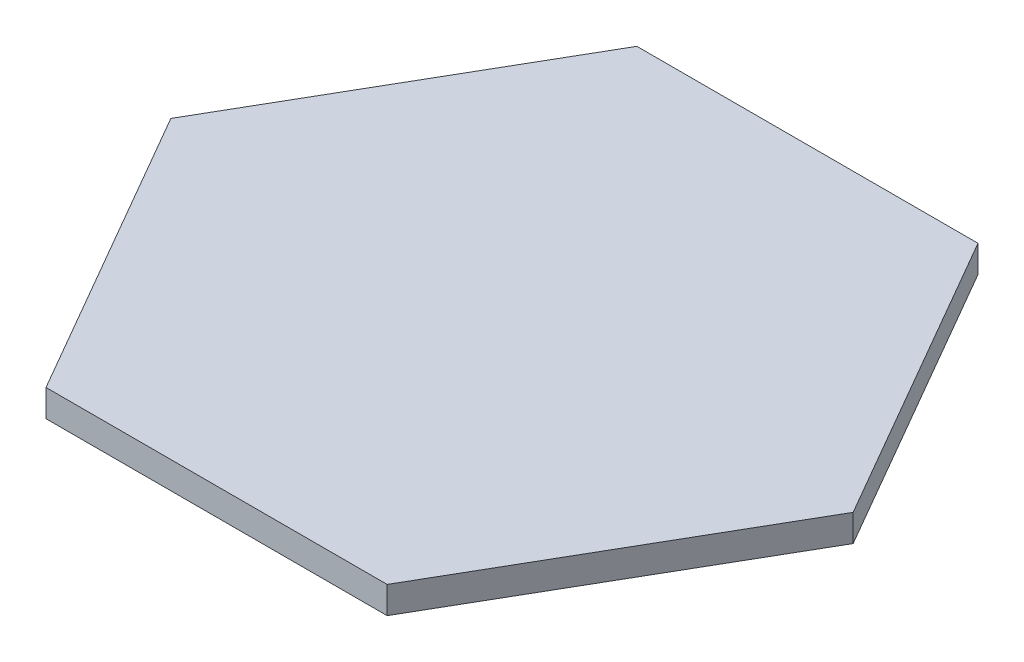
ISO-10303-21;
HEADER;
FILE_DESCRIPTION(('STEP AP214'),'2;1');
FILE_NAME('part.step','',(''),(''),'','','');
FILE_SCHEMA(('AUTOMOTIVE_DESIGN { 1 0 10303 214 1 1 1 1 }'));
ENDSEC;
DATA;
#1=APPLICATION_CONTEXT('core data for automotive mechanical design processes');
#2=APPLICATION_PROTOCOL_DEFINITION('international standard','automotive_design',2000,#1);
#3=PRODUCT_CONTEXT('',#1,'mechanical');
#4=PRODUCT('Part','Part','',(#3));
#5=PRODUCT_RELATED_PRODUCT_CATEGORY('part','',(#4));
#6=PRODUCT_DEFINITION_FORMATION('','',#4);
#7=PRODUCT_DEFINITION_CONTEXT('part definition',#1,'design');
#8=PRODUCT_DEFINITION('design','',#6,#7);
#9=PRODUCT_DEFINITION_SHAPE('','',#8);
#10=(LENGTH_UNIT() NAMED_UNIT(*) SI_UNIT(.MILLI.,.METRE.));
#11=(NAMED_UNIT(*) PLANE_ANGLE_UNIT() SI_UNIT($,.RADIAN.));
#12=(NAMED_UNIT(*) SI_UNIT($,.STERADIAN.) SOLID_ANGLE_UNIT());
#13=UNCERTAINTY_MEASURE_WITH_UNIT(LENGTH_MEASURE(1.E-05),#10,'distance_accuracy_value','');
#14=(GEOMETRIC_REPRESENTATION_CONTEXT(3) GLOBAL_UNCERTAINTY_ASSIGNED_CONTEXT((#13)) GLOBAL_UNIT_ASSIGNED_CONTEXT((#10,
#11,#12)) REPRESENTATION_CONTEXT('',''));
#15=CARTESIAN_POINT('',(0.,0.,0.));
#16=DIRECTION('',(0.,0.,1.));
#17=DIRECTION('',(1.,0.,0.));
#18=AXIS2_PLACEMENT_3D('',#15,#16,#17);
#19=CARTESIAN_POINT('',(-40.,6.35,-69.2820323027551));
#20=DIRECTION('',(0.866025403784439,0.,0.5));
#21=DIRECTION('',(0.5,0.,-0.866025403784439));
#22=AXIS2_PLACEMENT_3D('',#19,#20,#21);
#23=PLANE('',#22);
#24=DIRECTION('',(-0.5,0.,0.866025403784439));
#25=VECTOR('',#24,1.);
#26=CARTESIAN_POINT('',(-40.,0.,-69.2820323027551));
#27=LINE('',#26,#25);
#28=CARTESIAN_POINT('',(-40.,0.,-69.2820323027551));
#29=VERTEX_POINT('',#28);
#30=CARTESIAN_POINT('',(-80.,0.,0.));
#31=VERTEX_POINT('',#30);
#32=EDGE_CURVE('E117',#29,#31,#27,.T.);
#33=ORIENTED_EDGE('',*,*,#32,.T.);
#34=DIRECTION('',(0.,-1.,0.));
#35=VECTOR('',#34,1.);
#36=CARTESIAN_POINT('',(-80.,6.35,0.));
#37=LINE('',#36,#35);
#38=CARTESIAN_POINT('',(-80.,6.35,0.));
#39=VERTEX_POINT('',#38);
#40=EDGE_CURVE('E11',#39,#31,#37,.T.);
#41=ORIENTED_EDGE('',*,*,#40,.F.);
#42=DIRECTION('',(-0.5,0.,0.866025403784439));
#43=VECTOR('',#42,1.);
#44=CARTESIAN_POINT('',(-40.,6.35,-69.2820323027551));
#45=LINE('',#44,#43);
#46=CARTESIAN_POINT('',(-40.,6.35,-69.2820323027551));
#47=VERTEX_POINT('',#46);
#48=EDGE_CURVE('E127',#47,#39,#45,.T.);
#49=ORIENTED_EDGE('',*,*,#48,.F.);
#50=DIRECTION('',(0.,-1.,0.));
#51=VECTOR('',#50,1.);
#52=CARTESIAN_POINT('',(-40.,6.35,-69.2820323027551));
#53=LINE('',#52,#51);
#54=EDGE_CURVE('E113',#47,#29,#53,.T.);
#55=ORIENTED_EDGE('',*,*,#54,.T.);
#56=EDGE_LOOP('',(#33,#41,#49,#55));
#57=FACE_BOUND('',#56,.T.);
#58=ADVANCED_FACE('F33',(#57),#23,.F.);
#59=CARTESIAN_POINT('',(-80.,6.35,0.));
#60=DIRECTION('',(0.866025403784439,0.,-0.5));
#61=DIRECTION('',(-0.5,0.,-0.866025403784439));
#62=AXIS2_PLACEMENT_3D('',#59,#60,#61);
#63=PLANE('',#62);
#64=DIRECTION('',(0.5,0.,0.866025403784439));
#65=VECTOR('',#64,1.);
#66=CARTESIAN_POINT('',(-80.,0.,0.));
#67=LINE('',#66,#65);
#68=CARTESIAN_POINT('',(-40.,0.,69.2820323027551));
#69=VERTEX_POINT('',#68);
#70=EDGE_CURVE('E120',#31,#69,#67,.T.);
#71=ORIENTED_EDGE('',*,*,#70,.T.);
#72=DIRECTION('',(0.,-1.,0.));
#73=VECTOR('',#72,1.);
#74=CARTESIAN_POINT('',(-40.,6.35,69.2820323027551));
#75=LINE('',#74,#73);
#76=CARTESIAN_POINT('',(-40.,6.35,69.2820323027551));
#77=VERTEX_POINT('',#76);
#78=EDGE_CURVE('E41',#77,#69,#75,.T.);
#79=ORIENTED_EDGE('',*,*,#78,.F.);
#80=DIRECTION('',(0.5,0.,0.866025403784439));
#81=VECTOR('',#80,1.);
#82=CARTESIAN_POINT('',(-80.,6.35,0.));
#83=LINE('',#82,#81);
#84=EDGE_CURVE('E86',#39,#77,#83,.T.);
#85=ORIENTED_EDGE('',*,*,#84,.F.);
#86=ORIENTED_EDGE('',*,*,#40,.T.);
#87=EDGE_LOOP('',(#71,#79,#85,#86));
#88=FACE_BOUND('',#87,.T.);
#89=ADVANCED_FACE('F151',(#88),#63,.F.);
#90=CARTESIAN_POINT('',(-40.,6.35,69.2820323027551));
#91=DIRECTION('',(0.,0.,-1.));
#92=DIRECTION('',(-1.,0.,0.));
#93=AXIS2_PLACEMENT_3D('',#90,#91,#92);
#94=PLANE('',#93);
#95=DIRECTION('',(1.,0.,0.));
#96=VECTOR('',#95,1.);
#97=CARTESIAN_POINT('',(-40.,0.,69.2820323027551));
#98=LINE('',#97,#96);
#99=CARTESIAN_POINT('',(40.,0.,69.2820323027551));
#100=VERTEX_POINT('',#99);
#101=EDGE_CURVE('E122',#69,#100,#98,.T.);
#102=ORIENTED_EDGE('',*,*,#101,.T.);
#103=DIRECTION('',(0.,-1.,0.));
#104=VECTOR('',#103,1.);
#105=CARTESIAN_POINT('',(40.,6.35,69.2820323027551));
#106=LINE('',#105,#104);
#107=CARTESIAN_POINT('',(40.,6.35,69.2820323027551));
#108=VERTEX_POINT('',#107);
#109=EDGE_CURVE('E108',#108,#100,#106,.T.);
#110=ORIENTED_EDGE('',*,*,#109,.F.);
#111=DIRECTION('',(1.,0.,0.));
#112=VECTOR('',#111,1.);
#113=CARTESIAN_POINT('',(-40.,6.35,69.2820323027551));
#114=LINE('',#113,#112);
#115=EDGE_CURVE('E99',#77,#108,#114,.T.);
#116=ORIENTED_EDGE('',*,*,#115,.F.);
#117=ORIENTED_EDGE('',*,*,#78,.T.);
#118=EDGE_LOOP('',(#102,#110,#116,#117));
#119=FACE_BOUND('',#118,.T.);
#120=ADVANCED_FACE('F133',(#119),#94,.F.);
#121=CARTESIAN_POINT('',(40.,6.35,69.2820323027551));
#122=DIRECTION('',(-0.866025403784439,0.,-0.5));
#123=DIRECTION('',(-0.5,0.,0.866025403784439));
#124=AXIS2_PLACEMENT_3D('',#121,#122,#123);
#125=PLANE('',#124);
#126=DIRECTION('',(0.5,0.,-0.866025403784439));
#127=VECTOR('',#126,1.);
#128=CARTESIAN_POINT('',(40.,0.,69.2820323027551));
#129=LINE('',#128,#127);
#130=CARTESIAN_POINT('',(80.,0.,0.));
#131=VERTEX_POINT('',#130);
#132=EDGE_CURVE('E107',#100,#131,#129,.T.);
#133=ORIENTED_EDGE('',*,*,#132,.T.);
#134=DIRECTION('',(0.,-1.,0.));
#135=VECTOR('',#134,1.);
#136=CARTESIAN_POINT('',(80.,6.35,0.));
#137=LINE('',#136,#135);
#138=CARTESIAN_POINT('',(80.,6.35,0.));
#139=VERTEX_POINT('',#138);
#140=EDGE_CURVE('E104',#139,#131,#137,.T.);
#141=ORIENTED_EDGE('',*,*,#140,.F.);
#142=DIRECTION('',(0.5,0.,-0.866025403784439));
#143=VECTOR('',#142,1.);
#144=CARTESIAN_POINT('',(40.,6.35,69.2820323027551));
#145=LINE('',#144,#143);
#146=EDGE_CURVE('E93',#108,#139,#145,.T.);
#147=ORIENTED_EDGE('',*,*,#146,.F.);
#148=ORIENTED_EDGE('',*,*,#109,.T.);
#149=EDGE_LOOP('',(#133,#141,#147,#148));
#150=FACE_BOUND('',#149,.T.);
#151=ADVANCED_FACE('F105',(#150),#125,.F.);
#152=CARTESIAN_POINT('',(80.,6.35,0.));
#153=DIRECTION('',(-0.866025403784439,0.,0.499999999999999));
#154=DIRECTION('',(0.499999999999999,0.,0.866025403784439));
#155=AXIS2_PLACEMENT_3D('',#152,#153,#154);
#156=PLANE('',#155);
#157=DIRECTION('',(-0.499999999999999,0.,-0.866025403784439));
#158=VECTOR('',#157,1.);
#159=CARTESIAN_POINT('',(80.,0.,0.));
#160=LINE('',#159,#158);
#161=CARTESIAN_POINT('',(40.,0.,-69.2820323027551));
#162=VERTEX_POINT('',#161);
#163=EDGE_CURVE('E72',#131,#162,#160,.T.);
#164=ORIENTED_EDGE('',*,*,#163,.T.);
#165=DIRECTION('',(0.,-1.,0.));
#166=VECTOR('',#165,1.);
#167=CARTESIAN_POINT('',(40.,6.35,-69.2820323027551));
#168=LINE('',#167,#166);
#169=CARTESIAN_POINT('',(40.,6.35,-69.2820323027551));
#170=VERTEX_POINT('',#169);
#171=EDGE_CURVE('E109',#170,#162,#168,.T.);
#172=ORIENTED_EDGE('',*,*,#171,.F.);
#173=DIRECTION('',(-0.499999999999999,0.,-0.866025403784439));
#174=VECTOR('',#173,1.);
#175=CARTESIAN_POINT('',(80.,6.35,0.));
#176=LINE('',#175,#174);
#177=EDGE_CURVE('E97',#139,#170,#176,.T.);
#178=ORIENTED_EDGE('',*,*,#177,.F.);
#179=ORIENTED_EDGE('',*,*,#140,.T.);
#180=EDGE_LOOP('',(#164,#172,#178,#179));
#181=FACE_BOUND('',#180,.T.);
#182=ADVANCED_FACE('F111',(#181),#156,.F.);
#183=CARTESIAN_POINT('',(-40.,6.35,-69.2820323027551));
#184=DIRECTION('',(0.,0.,1.));
#185=DIRECTION('',(1.,0.,0.));
#186=AXIS2_PLACEMENT_3D('',#183,#184,#185);
#187=PLANE('',#186);
#188=DIRECTION('',(-1.,0.,0.));
#189=VECTOR('',#188,1.);
#190=CARTESIAN_POINT('',(-40.,0.,-69.2820323027551));
#191=LINE('',#190,#189);
#192=EDGE_CURVE('E78',#162,#29,#191,.T.);
#193=ORIENTED_EDGE('',*,*,#192,.T.);
#194=ORIENTED_EDGE('',*,*,#54,.F.);
#195=DIRECTION('',(-1.,0.,0.));
#196=VECTOR('',#195,1.);
#197=CARTESIAN_POINT('',(-40.,6.35,-69.2820323027551));
#198=LINE('',#197,#196);
#199=EDGE_CURVE('E49',#170,#47,#198,.T.);
#200=ORIENTED_EDGE('',*,*,#199,.F.);
#201=ORIENTED_EDGE('',*,*,#171,.T.);
#202=EDGE_LOOP('',(#193,#194,#200,#201));
#203=FACE_BOUND('',#202,.T.);
#204=ADVANCED_FACE('F140',(#203),#187,.F.);
#205=CARTESIAN_POINT('',(0.,6.35,0.));
#206=DIRECTION('',(0.,1.,0.));
#207=DIRECTION('',(0.,0.,1.));
#208=AXIS2_PLACEMENT_3D('',#205,#206,#207);
#209=PLANE('',#208);
#210=ORIENTED_EDGE('',*,*,#48,.T.);
#211=ORIENTED_EDGE('',*,*,#84,.T.);
#212=ORIENTED_EDGE('',*,*,#115,.T.);
#213=ORIENTED_EDGE('',*,*,#146,.T.);
#214=ORIENTED_EDGE('',*,*,#177,.T.);
#215=ORIENTED_EDGE('',*,*,#199,.T.);
#216=EDGE_LOOP('',(#210,#211,#212,#213,#214,#215));
#217=FACE_BOUND('',#216,.T.);
#218=ADVANCED_FACE('F95',(#217),#209,.T.);
#219=CARTESIAN_POINT('',(0.,0.,0.));
#220=DIRECTION('',(0.,1.,0.));
#221=DIRECTION('',(0.,0.,1.));
#222=AXIS2_PLACEMENT_3D('',#219,#220,#221);
#223=PLANE('',#222);
#224=ORIENTED_EDGE('',*,*,#32,.F.);
#225=ORIENTED_EDGE('',*,*,#192,.F.);
#226=ORIENTED_EDGE('',*,*,#163,.F.);
#227=ORIENTED_EDGE('',*,*,#132,.F.);
#228=ORIENTED_EDGE('',*,*,#101,.F.);
#229=ORIENTED_EDGE('',*,*,#70,.F.);
#230=EDGE_LOOP('',(#224,#225,#226,#227,#228,#229));
#231=FACE_BOUND('',#230,.T.);
#232=ADVANCED_FACE('F136',(#231),#223,.F.);
#233=CLOSED_SHELL('',(#58,#89,#120,#151,#182,#204,#218,#232));
#234=MANIFOLD_SOLID_BREP('B2',#233);
#235=ADVANCED_BREP_SHAPE_REPRESENTATION('',(#18,#234),#14);
#236=SHAPE_DEFINITION_REPRESENTATION(#9,#235);
ENDSEC;
END-ISO-10303-21;
